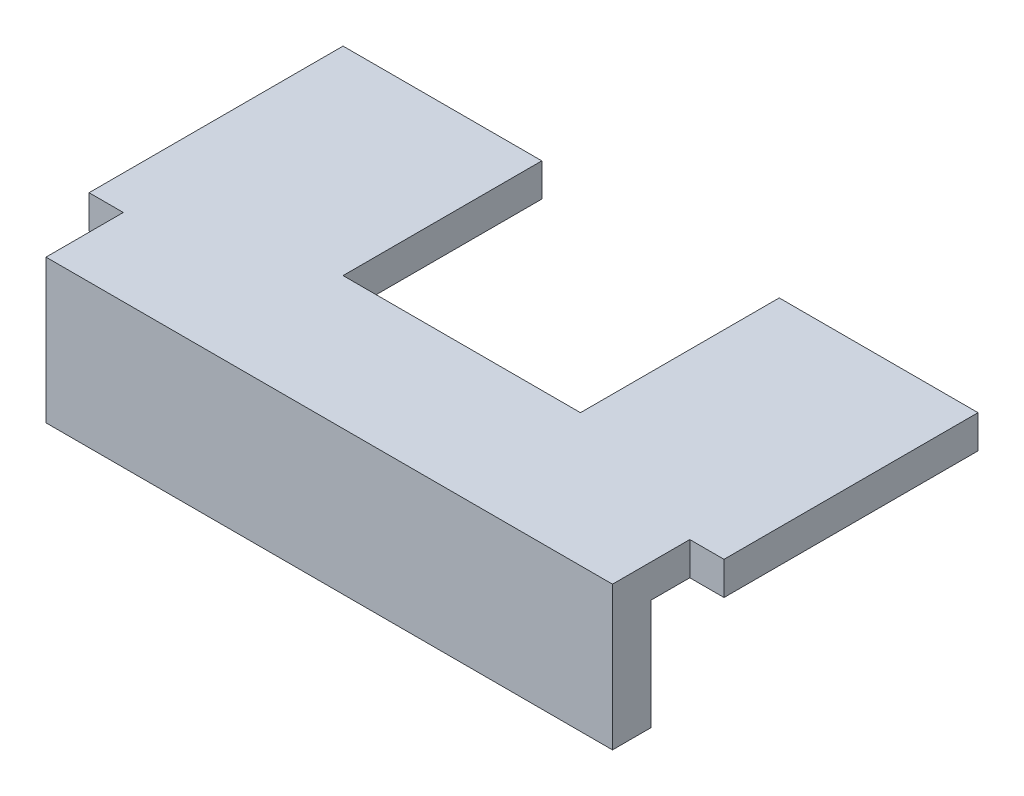
ISO-10303-21;
HEADER;
FILE_DESCRIPTION(('STEP AP214'),'2;1');
FILE_NAME('part.step','',(''),(''),'','','');
FILE_SCHEMA(('AUTOMOTIVE_DESIGN { 1 0 10303 214 1 1 1 1 }'));
ENDSEC;
DATA;
#1=APPLICATION_CONTEXT('core data for automotive mechanical design processes');
#2=APPLICATION_PROTOCOL_DEFINITION('international standard','automotive_design',2000,#1);
#3=PRODUCT_CONTEXT('',#1,'mechanical');
#4=PRODUCT('Part','Part','',(#3));
#5=PRODUCT_RELATED_PRODUCT_CATEGORY('part','',(#4));
#6=PRODUCT_DEFINITION_FORMATION('','',#4);
#7=PRODUCT_DEFINITION_CONTEXT('part definition',#1,'design');
#8=PRODUCT_DEFINITION('design','',#6,#7);
#9=PRODUCT_DEFINITION_SHAPE('','',#8);
#10=(LENGTH_UNIT() NAMED_UNIT(*) SI_UNIT(.MILLI.,.METRE.));
#11=(NAMED_UNIT(*) PLANE_ANGLE_UNIT() SI_UNIT($,.RADIAN.));
#12=(NAMED_UNIT(*) SI_UNIT($,.STERADIAN.) SOLID_ANGLE_UNIT());
#13=UNCERTAINTY_MEASURE_WITH_UNIT(LENGTH_MEASURE(1.E-05),#10,'distance_accuracy_value','');
#14=(GEOMETRIC_REPRESENTATION_CONTEXT(3) GLOBAL_UNCERTAINTY_ASSIGNED_CONTEXT((#13)) GLOBAL_UNIT_ASSIGNED_CONTEXT((#10,
#11,#12)) REPRESENTATION_CONTEXT('',''));
#15=CARTESIAN_POINT('',(0.,0.,0.));
#16=DIRECTION('',(0.,0.,1.));
#17=DIRECTION('',(1.,0.,0.));
#18=AXIS2_PLACEMENT_3D('',#15,#16,#17);
#19=CARTESIAN_POINT('',(0.,0.,0.));
#20=DIRECTION('',(0.,1.,0.));
#21=DIRECTION('',(0.,0.,1.));
#22=AXIS2_PLACEMENT_3D('',#19,#20,#21);
#23=PLANE('',#22);
#24=DIRECTION('',(1.,0.,0.));
#25=VECTOR('',#24,1.);
#26=CARTESIAN_POINT('',(-25.65,0.,-3.5));
#27=LINE('',#26,#25);
#28=CARTESIAN_POINT('',(-25.65,0.,-3.5));
#29=VERTEX_POINT('',#28);
#30=CARTESIAN_POINT('',(25.65,0.,-3.5));
#31=VERTEX_POINT('',#30);
#32=EDGE_CURVE('E58',#29,#31,#27,.T.);
#33=ORIENTED_EDGE('',*,*,#32,.F.);
#34=DIRECTION('',(0.,0.,-1.));
#35=VECTOR('',#34,1.);
#36=CARTESIAN_POINT('',(-25.65,0.,0.));
#37=LINE('',#36,#35);
#38=CARTESIAN_POINT('',(-25.65,0.,-6.99999999999999));
#39=VERTEX_POINT('',#38);
#40=EDGE_CURVE('E104',#29,#39,#37,.T.);
#41=ORIENTED_EDGE('',*,*,#40,.T.);
#42=DIRECTION('',(-1.,0.,0.));
#43=VECTOR('',#42,1.);
#44=CARTESIAN_POINT('',(0.,0.,-7.));
#45=LINE('',#44,#43);
#46=CARTESIAN_POINT('',(-28.75,0.,-6.99999999999999));
#47=VERTEX_POINT('',#46);
#48=EDGE_CURVE('E193',#39,#47,#45,.T.);
#49=ORIENTED_EDGE('',*,*,#48,.T.);
#50=DIRECTION('',(0.,0.,-1.));
#51=VECTOR('',#50,1.);
#52=CARTESIAN_POINT('',(-28.75,0.,0.));
#53=LINE('',#52,#51);
#54=CARTESIAN_POINT('',(-28.75,0.,-30.));
#55=VERTEX_POINT('',#54);
#56=EDGE_CURVE('E147',#47,#55,#53,.T.);
#57=ORIENTED_EDGE('',*,*,#56,.T.);
#58=DIRECTION('',(1.,0.,0.));
#59=VECTOR('',#58,1.);
#60=CARTESIAN_POINT('',(0.,0.,-30.));
#61=LINE('',#60,#59);
#62=CARTESIAN_POINT('',(-10.75,0.,-30.));
#63=VERTEX_POINT('',#62);
#64=EDGE_CURVE('E189',#55,#63,#61,.T.);
#65=ORIENTED_EDGE('',*,*,#64,.T.);
#66=DIRECTION('',(0.,0.,1.));
#67=VECTOR('',#66,1.);
#68=CARTESIAN_POINT('',(-10.75,0.,0.));
#69=LINE('',#68,#67);
#70=CARTESIAN_POINT('',(-10.75,0.,-12.));
#71=VERTEX_POINT('',#70);
#72=EDGE_CURVE('E186',#63,#71,#69,.T.);
#73=ORIENTED_EDGE('',*,*,#72,.T.);
#74=DIRECTION('',(1.,0.,0.));
#75=VECTOR('',#74,1.);
#76=CARTESIAN_POINT('',(0.,0.,-12.));
#77=LINE('',#76,#75);
#78=CARTESIAN_POINT('',(10.75,0.,-12.));
#79=VERTEX_POINT('',#78);
#80=EDGE_CURVE('E183',#71,#79,#77,.T.);
#81=ORIENTED_EDGE('',*,*,#80,.T.);
#82=DIRECTION('',(0.,0.,1.));
#83=VECTOR('',#82,1.);
#84=CARTESIAN_POINT('',(10.75,0.,0.));
#85=LINE('',#84,#83);
#86=CARTESIAN_POINT('',(10.75,0.,-30.));
#87=VERTEX_POINT('',#86);
#88=EDGE_CURVE('E180',#87,#79,#85,.T.);
#89=ORIENTED_EDGE('',*,*,#88,.F.);
#90=DIRECTION('',(-1.,0.,0.));
#91=VECTOR('',#90,1.);
#92=CARTESIAN_POINT('',(0.,0.,-30.));
#93=LINE('',#92,#91);
#94=CARTESIAN_POINT('',(28.75,0.,-30.));
#95=VERTEX_POINT('',#94);
#96=EDGE_CURVE('E178',#95,#87,#93,.T.);
#97=ORIENTED_EDGE('',*,*,#96,.F.);
#98=DIRECTION('',(0.,0.,-1.));
#99=VECTOR('',#98,1.);
#100=CARTESIAN_POINT('',(28.75,0.,0.));
#101=LINE('',#100,#99);
#102=CARTESIAN_POINT('',(28.75,0.,-7.));
#103=VERTEX_POINT('',#102);
#104=EDGE_CURVE('E176',#103,#95,#101,.T.);
#105=ORIENTED_EDGE('',*,*,#104,.F.);
#106=DIRECTION('',(1.,0.,0.));
#107=VECTOR('',#106,1.);
#108=CARTESIAN_POINT('',(0.,0.,-7.));
#109=LINE('',#108,#107);
#110=CARTESIAN_POINT('',(25.65,0.,-7.));
#111=VERTEX_POINT('',#110);
#112=EDGE_CURVE('E173',#111,#103,#109,.T.);
#113=ORIENTED_EDGE('',*,*,#112,.F.);
#114=DIRECTION('',(0.,0.,-1.));
#115=VECTOR('',#114,1.);
#116=CARTESIAN_POINT('',(25.65,0.,0.));
#117=LINE('',#116,#115);
#118=EDGE_CURVE('E171',#31,#111,#117,.T.);
#119=ORIENTED_EDGE('',*,*,#118,.F.);
#120=EDGE_LOOP('',(#33,#41,#49,#57,#65,#73,#81,#89,#97,#105,#113,#119));
#121=FACE_BOUND('',#120,.T.);
#122=ADVANCED_FACE('F43',(#121),#23,.F.);
#123=CARTESIAN_POINT('',(0.,3.,0.));
#124=DIRECTION('',(0.,0.,1.));
#125=DIRECTION('',(1.,0.,0.));
#126=AXIS2_PLACEMENT_3D('',#123,#124,#125);
#127=PLANE('',#126);
#128=DIRECTION('',(0.,-1.,0.));
#129=VECTOR('',#128,1.);
#130=CARTESIAN_POINT('',(-25.65,3.,0.));
#131=LINE('',#130,#129);
#132=CARTESIAN_POINT('',(-25.65,3.,0.));
#133=VERTEX_POINT('',#132);
#134=CARTESIAN_POINT('',(-25.65,-10.,0.));
#135=VERTEX_POINT('',#134);
#136=EDGE_CURVE('E67',#133,#135,#131,.T.);
#137=ORIENTED_EDGE('',*,*,#136,.T.);
#138=DIRECTION('',(-1.,0.,0.));
#139=VECTOR('',#138,1.);
#140=CARTESIAN_POINT('',(-25.65,-10.,0.));
#141=LINE('',#140,#139);
#142=CARTESIAN_POINT('',(25.65,-10.,0.));
#143=VERTEX_POINT('',#142);
#144=EDGE_CURVE('E382',#143,#135,#141,.T.);
#145=ORIENTED_EDGE('',*,*,#144,.F.);
#146=DIRECTION('',(0.,-1.,0.));
#147=VECTOR('',#146,1.);
#148=CARTESIAN_POINT('',(25.65,3.,0.));
#149=LINE('',#148,#147);
#150=CARTESIAN_POINT('',(25.65,3.,0.));
#151=VERTEX_POINT('',#150);
#152=EDGE_CURVE('E11',#151,#143,#149,.T.);
#153=ORIENTED_EDGE('',*,*,#152,.F.);
#154=DIRECTION('',(-1.,0.,0.));
#155=VECTOR('',#154,1.);
#156=CARTESIAN_POINT('',(0.,3.,0.));
#157=LINE('',#156,#155);
#158=EDGE_CURVE('E196',#151,#133,#157,.T.);
#159=ORIENTED_EDGE('',*,*,#158,.T.);
#160=EDGE_LOOP('',(#137,#145,#153,#159));
#161=FACE_BOUND('',#160,.T.);
#162=ADVANCED_FACE('F45',(#161),#127,.T.);
#163=CARTESIAN_POINT('',(25.65,3.,0.));
#164=DIRECTION('',(-1.,0.,0.));
#165=DIRECTION('',(0.,0.,1.));
#166=AXIS2_PLACEMENT_3D('',#163,#164,#165);
#167=PLANE('',#166);
#168=ORIENTED_EDGE('',*,*,#152,.T.);
#169=DIRECTION('',(0.,0.,1.));
#170=VECTOR('',#169,1.);
#171=CARTESIAN_POINT('',(25.65,-10.,0.));
#172=LINE('',#171,#170);
#173=CARTESIAN_POINT('',(25.65,-10.,-3.5));
#174=VERTEX_POINT('',#173);
#175=EDGE_CURVE('E396',#174,#143,#172,.T.);
#176=ORIENTED_EDGE('',*,*,#175,.F.);
#177=DIRECTION('',(0.,1.,0.));
#178=VECTOR('',#177,1.);
#179=CARTESIAN_POINT('',(25.65,-10.,-3.5));
#180=LINE('',#179,#178);
#181=EDGE_CURVE('E386',#174,#31,#180,.T.);
#182=ORIENTED_EDGE('',*,*,#181,.T.);
#183=ORIENTED_EDGE('',*,*,#118,.T.);
#184=DIRECTION('',(0.,-1.,0.));
#185=VECTOR('',#184,1.);
#186=CARTESIAN_POINT('',(25.65,3.,-7.));
#187=LINE('',#186,#185);
#188=CARTESIAN_POINT('',(25.65,3.,-7.));
#189=VERTEX_POINT('',#188);
#190=EDGE_CURVE('E51',#189,#111,#187,.T.);
#191=ORIENTED_EDGE('',*,*,#190,.F.);
#192=DIRECTION('',(0.,0.,-1.));
#193=VECTOR('',#192,1.);
#194=CARTESIAN_POINT('',(25.65,3.,0.));
#195=LINE('',#194,#193);
#196=EDGE_CURVE('E393',#151,#189,#195,.T.);
#197=ORIENTED_EDGE('',*,*,#196,.F.);
#198=EDGE_LOOP('',(#168,#176,#182,#183,#191,#197));
#199=FACE_BOUND('',#198,.T.);
#200=ADVANCED_FACE('F275',(#199),#167,.F.);
#201=CARTESIAN_POINT('',(0.,3.,-7.));
#202=DIRECTION('',(0.,0.,-1.));
#203=DIRECTION('',(-1.,0.,0.));
#204=AXIS2_PLACEMENT_3D('',#201,#202,#203);
#205=PLANE('',#204);
#206=ORIENTED_EDGE('',*,*,#112,.T.);
#207=DIRECTION('',(0.,-1.,0.));
#208=VECTOR('',#207,1.);
#209=CARTESIAN_POINT('',(28.75,3.,-7.));
#210=LINE('',#209,#208);
#211=CARTESIAN_POINT('',(28.75,3.,-7.));
#212=VERTEX_POINT('',#211);
#213=EDGE_CURVE('E212',#212,#103,#210,.T.);
#214=ORIENTED_EDGE('',*,*,#213,.F.);
#215=DIRECTION('',(1.,0.,0.));
#216=VECTOR('',#215,1.);
#217=CARTESIAN_POINT('',(0.,3.,-7.));
#218=LINE('',#217,#216);
#219=EDGE_CURVE('E221',#189,#212,#218,.T.);
#220=ORIENTED_EDGE('',*,*,#219,.F.);
#221=ORIENTED_EDGE('',*,*,#190,.T.);
#222=EDGE_LOOP('',(#206,#214,#220,#221));
#223=FACE_BOUND('',#222,.T.);
#224=ADVANCED_FACE('F219',(#223),#205,.F.);
#225=CARTESIAN_POINT('',(28.75,3.,0.));
#226=DIRECTION('',(-1.,0.,0.));
#227=DIRECTION('',(0.,0.,1.));
#228=AXIS2_PLACEMENT_3D('',#225,#226,#227);
#229=PLANE('',#228);
#230=ORIENTED_EDGE('',*,*,#104,.T.);
#231=DIRECTION('',(0.,-1.,0.));
#232=VECTOR('',#231,1.);
#233=CARTESIAN_POINT('',(28.75,3.,-30.));
#234=LINE('',#233,#232);
#235=CARTESIAN_POINT('',(28.75,3.,-30.));
#236=VERTEX_POINT('',#235);
#237=EDGE_CURVE('E209',#236,#95,#234,.T.);
#238=ORIENTED_EDGE('',*,*,#237,.F.);
#239=DIRECTION('',(0.,0.,-1.));
#240=VECTOR('',#239,1.);
#241=CARTESIAN_POINT('',(28.75,3.,0.));
#242=LINE('',#241,#240);
#243=EDGE_CURVE('E237',#212,#236,#242,.T.);
#244=ORIENTED_EDGE('',*,*,#243,.F.);
#245=ORIENTED_EDGE('',*,*,#213,.T.);
#246=EDGE_LOOP('',(#230,#238,#244,#245));
#247=FACE_BOUND('',#246,.T.);
#248=ADVANCED_FACE('F228',(#247),#229,.F.);
#249=CARTESIAN_POINT('',(0.,3.,-30.));
#250=DIRECTION('',(0.,0.,1.));
#251=DIRECTION('',(1.,0.,0.));
#252=AXIS2_PLACEMENT_3D('',#249,#250,#251);
#253=PLANE('',#252);
#254=ORIENTED_EDGE('',*,*,#96,.T.);
#255=DIRECTION('',(0.,-1.,0.));
#256=VECTOR('',#255,1.);
#257=CARTESIAN_POINT('',(10.75,3.,-30.));
#258=LINE('',#257,#256);
#259=CARTESIAN_POINT('',(10.75,3.,-30.));
#260=VERTEX_POINT('',#259);
#261=EDGE_CURVE('E206',#260,#87,#258,.T.);
#262=ORIENTED_EDGE('',*,*,#261,.F.);
#263=DIRECTION('',(-1.,0.,0.));
#264=VECTOR('',#263,1.);
#265=CARTESIAN_POINT('',(0.,3.,-30.));
#266=LINE('',#265,#264);
#267=EDGE_CURVE('E234',#236,#260,#266,.T.);
#268=ORIENTED_EDGE('',*,*,#267,.F.);
#269=ORIENTED_EDGE('',*,*,#237,.T.);
#270=EDGE_LOOP('',(#254,#262,#268,#269));
#271=FACE_BOUND('',#270,.T.);
#272=ADVANCED_FACE('F232',(#271),#253,.F.);
#273=CARTESIAN_POINT('',(10.75,3.,0.));
#274=DIRECTION('',(1.,0.,0.));
#275=DIRECTION('',(0.,0.,-1.));
#276=AXIS2_PLACEMENT_3D('',#273,#274,#275);
#277=PLANE('',#276);
#278=ORIENTED_EDGE('',*,*,#88,.T.);
#279=DIRECTION('',(0.,-1.,0.));
#280=VECTOR('',#279,1.);
#281=CARTESIAN_POINT('',(10.75,3.,-12.));
#282=LINE('',#281,#280);
#283=CARTESIAN_POINT('',(10.75,3.,-12.));
#284=VERTEX_POINT('',#283);
#285=EDGE_CURVE('E204',#284,#79,#282,.T.);
#286=ORIENTED_EDGE('',*,*,#285,.F.);
#287=DIRECTION('',(0.,0.,1.));
#288=VECTOR('',#287,1.);
#289=CARTESIAN_POINT('',(10.75,3.,0.));
#290=LINE('',#289,#288);
#291=EDGE_CURVE('E236',#260,#284,#290,.T.);
#292=ORIENTED_EDGE('',*,*,#291,.F.);
#293=ORIENTED_EDGE('',*,*,#261,.T.);
#294=EDGE_LOOP('',(#278,#286,#292,#293));
#295=FACE_BOUND('',#294,.T.);
#296=ADVANCED_FACE('F260',(#295),#277,.F.);
#297=CARTESIAN_POINT('',(0.,3.,-12.));
#298=DIRECTION('',(0.,0.,-1.));
#299=DIRECTION('',(-1.,0.,0.));
#300=AXIS2_PLACEMENT_3D('',#297,#298,#299);
#301=PLANE('',#300);
#302=ORIENTED_EDGE('',*,*,#80,.F.);
#303=DIRECTION('',(0.,-1.,0.));
#304=VECTOR('',#303,1.);
#305=CARTESIAN_POINT('',(-10.75,3.,-12.));
#306=LINE('',#305,#304);
#307=CARTESIAN_POINT('',(-10.75,3.,-12.));
#308=VERTEX_POINT('',#307);
#309=EDGE_CURVE('E202',#308,#71,#306,.T.);
#310=ORIENTED_EDGE('',*,*,#309,.F.);
#311=DIRECTION('',(1.,0.,0.));
#312=VECTOR('',#311,1.);
#313=CARTESIAN_POINT('',(0.,3.,-12.));
#314=LINE('',#313,#312);
#315=EDGE_CURVE('E239',#308,#284,#314,.T.);
#316=ORIENTED_EDGE('',*,*,#315,.T.);
#317=ORIENTED_EDGE('',*,*,#285,.T.);
#318=EDGE_LOOP('',(#302,#310,#316,#317));
#319=FACE_BOUND('',#318,.T.);
#320=ADVANCED_FACE('F257',(#319),#301,.T.);
#321=CARTESIAN_POINT('',(-10.75,3.,0.));
#322=DIRECTION('',(1.,0.,0.));
#323=DIRECTION('',(0.,0.,-1.));
#324=AXIS2_PLACEMENT_3D('',#321,#322,#323);
#325=PLANE('',#324);
#326=ORIENTED_EDGE('',*,*,#72,.F.);
#327=DIRECTION('',(0.,-1.,0.));
#328=VECTOR('',#327,1.);
#329=CARTESIAN_POINT('',(-10.75,3.,-30.));
#330=LINE('',#329,#328);
#331=CARTESIAN_POINT('',(-10.75,3.,-30.));
#332=VERTEX_POINT('',#331);
#333=EDGE_CURVE('E200',#332,#63,#330,.T.);
#334=ORIENTED_EDGE('',*,*,#333,.F.);
#335=DIRECTION('',(0.,0.,1.));
#336=VECTOR('',#335,1.);
#337=CARTESIAN_POINT('',(-10.75,3.,0.));
#338=LINE('',#337,#336);
#339=EDGE_CURVE('E246',#332,#308,#338,.T.);
#340=ORIENTED_EDGE('',*,*,#339,.T.);
#341=ORIENTED_EDGE('',*,*,#309,.T.);
#342=EDGE_LOOP('',(#326,#334,#340,#341));
#343=FACE_BOUND('',#342,.T.);
#344=ADVANCED_FACE('F254',(#343),#325,.T.);
#345=CARTESIAN_POINT('',(0.,3.,-30.));
#346=DIRECTION('',(0.,0.,-1.));
#347=DIRECTION('',(-1.,0.,0.));
#348=AXIS2_PLACEMENT_3D('',#345,#346,#347);
#349=PLANE('',#348);
#350=ORIENTED_EDGE('',*,*,#64,.F.);
#351=DIRECTION('',(0.,-1.,0.));
#352=VECTOR('',#351,1.);
#353=CARTESIAN_POINT('',(-28.75,3.,-30.));
#354=LINE('',#353,#352);
#355=CARTESIAN_POINT('',(-28.75,3.,-30.));
#356=VERTEX_POINT('',#355);
#357=EDGE_CURVE('E151',#356,#55,#354,.T.);
#358=ORIENTED_EDGE('',*,*,#357,.F.);
#359=DIRECTION('',(1.,0.,0.));
#360=VECTOR('',#359,1.);
#361=CARTESIAN_POINT('',(0.,3.,-30.));
#362=LINE('',#361,#360);
#363=EDGE_CURVE('E163',#356,#332,#362,.T.);
#364=ORIENTED_EDGE('',*,*,#363,.T.);
#365=ORIENTED_EDGE('',*,*,#333,.T.);
#366=EDGE_LOOP('',(#350,#358,#364,#365));
#367=FACE_BOUND('',#366,.T.);
#368=ADVANCED_FACE('F250',(#367),#349,.T.);
#369=CARTESIAN_POINT('',(-28.75,3.,0.));
#370=DIRECTION('',(-1.,0.,0.));
#371=DIRECTION('',(0.,0.,1.));
#372=AXIS2_PLACEMENT_3D('',#369,#370,#371);
#373=PLANE('',#372);
#374=ORIENTED_EDGE('',*,*,#56,.F.);
#375=DIRECTION('',(0.,-1.,0.));
#376=VECTOR('',#375,1.);
#377=CARTESIAN_POINT('',(-28.75,3.,-6.99999999999999));
#378=LINE('',#377,#376);
#379=CARTESIAN_POINT('',(-28.75,3.,-6.99999999999999));
#380=VERTEX_POINT('',#379);
#381=EDGE_CURVE('E142',#380,#47,#378,.T.);
#382=ORIENTED_EDGE('',*,*,#381,.F.);
#383=DIRECTION('',(0.,0.,-1.));
#384=VECTOR('',#383,1.);
#385=CARTESIAN_POINT('',(-28.75,3.,0.));
#386=LINE('',#385,#384);
#387=EDGE_CURVE('E145',#380,#356,#386,.T.);
#388=ORIENTED_EDGE('',*,*,#387,.T.);
#389=ORIENTED_EDGE('',*,*,#357,.T.);
#390=EDGE_LOOP('',(#374,#382,#388,#389));
#391=FACE_BOUND('',#390,.T.);
#392=ADVANCED_FACE('F144',(#391),#373,.T.);
#393=CARTESIAN_POINT('',(0.,3.,-7.));
#394=DIRECTION('',(0.,0.,1.));
#395=DIRECTION('',(1.,0.,0.));
#396=AXIS2_PLACEMENT_3D('',#393,#394,#395);
#397=PLANE('',#396);
#398=ORIENTED_EDGE('',*,*,#48,.F.);
#399=DIRECTION('',(0.,-1.,0.));
#400=VECTOR('',#399,1.);
#401=CARTESIAN_POINT('',(-25.65,3.,-6.99999999999999));
#402=LINE('',#401,#400);
#403=CARTESIAN_POINT('',(-25.65,3.,-6.99999999999999));
#404=VERTEX_POINT('',#403);
#405=EDGE_CURVE('E152',#404,#39,#402,.T.);
#406=ORIENTED_EDGE('',*,*,#405,.F.);
#407=DIRECTION('',(-1.,0.,0.));
#408=VECTOR('',#407,1.);
#409=CARTESIAN_POINT('',(0.,3.,-7.));
#410=LINE('',#409,#408);
#411=EDGE_CURVE('E160',#404,#380,#410,.T.);
#412=ORIENTED_EDGE('',*,*,#411,.T.);
#413=ORIENTED_EDGE('',*,*,#381,.T.);
#414=EDGE_LOOP('',(#398,#406,#412,#413));
#415=FACE_BOUND('',#414,.T.);
#416=ADVANCED_FACE('F165',(#415),#397,.T.);
#417=CARTESIAN_POINT('',(-25.65,3.,0.));
#418=DIRECTION('',(-1.,0.,0.));
#419=DIRECTION('',(0.,0.,1.));
#420=AXIS2_PLACEMENT_3D('',#417,#418,#419);
#421=PLANE('',#420);
#422=ORIENTED_EDGE('',*,*,#40,.F.);
#423=DIRECTION('',(0.,1.,0.));
#424=VECTOR('',#423,1.);
#425=CARTESIAN_POINT('',(-25.65,-10.,-3.5));
#426=LINE('',#425,#424);
#427=CARTESIAN_POINT('',(-25.65,-10.,-3.5));
#428=VERTEX_POINT('',#427);
#429=EDGE_CURVE('E174',#428,#29,#426,.T.);
#430=ORIENTED_EDGE('',*,*,#429,.F.);
#431=DIRECTION('',(0.,0.,-1.));
#432=VECTOR('',#431,1.);
#433=CARTESIAN_POINT('',(-25.65,-10.,0.));
#434=LINE('',#433,#432);
#435=EDGE_CURVE('E375',#135,#428,#434,.T.);
#436=ORIENTED_EDGE('',*,*,#435,.F.);
#437=ORIENTED_EDGE('',*,*,#136,.F.);
#438=DIRECTION('',(0.,0.,-1.));
#439=VECTOR('',#438,1.);
#440=CARTESIAN_POINT('',(-25.65,3.,0.));
#441=LINE('',#440,#439);
#442=EDGE_CURVE('E166',#133,#404,#441,.T.);
#443=ORIENTED_EDGE('',*,*,#442,.T.);
#444=ORIENTED_EDGE('',*,*,#405,.T.);
#445=EDGE_LOOP('',(#422,#430,#436,#437,#443,#444));
#446=FACE_BOUND('',#445,.T.);
#447=ADVANCED_FACE('F279',(#446),#421,.T.);
#448=CARTESIAN_POINT('',(0.,3.,0.));
#449=DIRECTION('',(0.,1.,0.));
#450=DIRECTION('',(0.,0.,1.));
#451=AXIS2_PLACEMENT_3D('',#448,#449,#450);
#452=PLANE('',#451);
#453=ORIENTED_EDGE('',*,*,#158,.F.);
#454=ORIENTED_EDGE('',*,*,#196,.T.);
#455=ORIENTED_EDGE('',*,*,#219,.T.);
#456=ORIENTED_EDGE('',*,*,#243,.T.);
#457=ORIENTED_EDGE('',*,*,#267,.T.);
#458=ORIENTED_EDGE('',*,*,#291,.T.);
#459=ORIENTED_EDGE('',*,*,#315,.F.);
#460=ORIENTED_EDGE('',*,*,#339,.F.);
#461=ORIENTED_EDGE('',*,*,#363,.F.);
#462=ORIENTED_EDGE('',*,*,#387,.F.);
#463=ORIENTED_EDGE('',*,*,#411,.F.);
#464=ORIENTED_EDGE('',*,*,#442,.F.);
#465=EDGE_LOOP('',(#453,#454,#455,#456,#457,#458,#459,#460,#461,#462,#463,#464));
#466=FACE_BOUND('',#465,.T.);
#467=ADVANCED_FACE('F158',(#466),#452,.T.);
#468=CARTESIAN_POINT('',(-25.65,-10.,-3.5));
#469=DIRECTION('',(0.,0.,1.));
#470=DIRECTION('',(1.,0.,0.));
#471=AXIS2_PLACEMENT_3D('',#468,#469,#470);
#472=PLANE('',#471);
#473=ORIENTED_EDGE('',*,*,#32,.T.);
#474=ORIENTED_EDGE('',*,*,#181,.F.);
#475=DIRECTION('',(1.,0.,0.));
#476=VECTOR('',#475,1.);
#477=CARTESIAN_POINT('',(-25.65,-10.,-3.5));
#478=LINE('',#477,#476);
#479=EDGE_CURVE('E380',#428,#174,#478,.T.);
#480=ORIENTED_EDGE('',*,*,#479,.F.);
#481=ORIENTED_EDGE('',*,*,#429,.T.);
#482=EDGE_LOOP('',(#473,#474,#480,#481));
#483=FACE_BOUND('',#482,.T.);
#484=ADVANCED_FACE('F314',(#483),#472,.F.);
#485=CARTESIAN_POINT('',(0.,-10.,0.));
#486=DIRECTION('',(0.,-1.,0.));
#487=DIRECTION('',(0.,0.,-1.));
#488=AXIS2_PLACEMENT_3D('',#485,#486,#487);
#489=PLANE('',#488);
#490=ORIENTED_EDGE('',*,*,#435,.T.);
#491=ORIENTED_EDGE('',*,*,#479,.T.);
#492=ORIENTED_EDGE('',*,*,#175,.T.);
#493=ORIENTED_EDGE('',*,*,#144,.T.);
#494=EDGE_LOOP('',(#490,#491,#492,#493));
#495=FACE_BOUND('',#494,.T.);
#496=ADVANCED_FACE('F359',(#495),#489,.T.);
#497=CLOSED_SHELL('',(#122,#162,#200,#224,#248,#272,#296,#320,#344,#368,#392,#416,#447,#467,
#484,#496));
#498=MANIFOLD_SOLID_BREP('B2',#497);
#499=ADVANCED_BREP_SHAPE_REPRESENTATION('',(#18,#498),#14);
#500=SHAPE_DEFINITION_REPRESENTATION(#9,#499);
ENDSEC;
END-ISO-10303-21;
